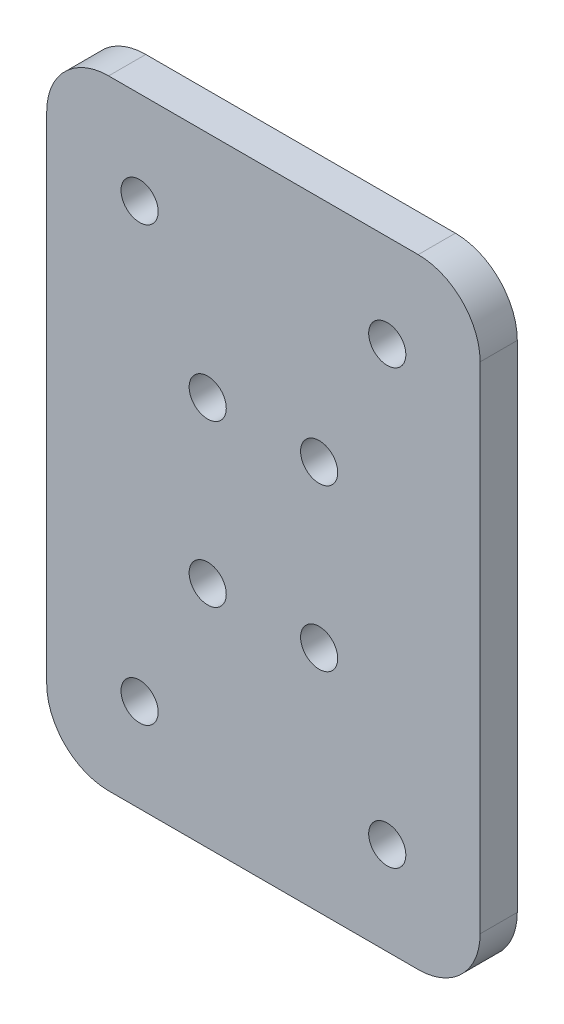
ISO-10303-21;
HEADER;
FILE_DESCRIPTION(('STEP AP214'),'2;1');
FILE_NAME('part.step','',(''),(''),'','','');
FILE_SCHEMA(('AUTOMOTIVE_DESIGN { 1 0 10303 214 1 1 1 1 }'));
ENDSEC;
DATA;
#1=APPLICATION_CONTEXT('core data for automotive mechanical design processes');
#2=APPLICATION_PROTOCOL_DEFINITION('international standard','automotive_design',2000,#1);
#3=PRODUCT_CONTEXT('',#1,'mechanical');
#4=PRODUCT('Part','Part','',(#3));
#5=PRODUCT_RELATED_PRODUCT_CATEGORY('part','',(#4));
#6=PRODUCT_DEFINITION_FORMATION('','',#4);
#7=PRODUCT_DEFINITION_CONTEXT('part definition',#1,'design');
#8=PRODUCT_DEFINITION('design','',#6,#7);
#9=PRODUCT_DEFINITION_SHAPE('','',#8);
#10=(LENGTH_UNIT() NAMED_UNIT(*) SI_UNIT(.MILLI.,.METRE.));
#11=(NAMED_UNIT(*) PLANE_ANGLE_UNIT() SI_UNIT($,.RADIAN.));
#12=(NAMED_UNIT(*) SI_UNIT($,.STERADIAN.) SOLID_ANGLE_UNIT());
#13=UNCERTAINTY_MEASURE_WITH_UNIT(LENGTH_MEASURE(1.E-05),#10,'distance_accuracy_value','');
#14=(GEOMETRIC_REPRESENTATION_CONTEXT(3) GLOBAL_UNCERTAINTY_ASSIGNED_CONTEXT((#13)) GLOBAL_UNIT_ASSIGNED_CONTEXT((#10,
#11,#12)) REPRESENTATION_CONTEXT('',''));
#15=CARTESIAN_POINT('',(0.,0.,0.));
#16=DIRECTION('',(0.,0.,1.));
#17=DIRECTION('',(1.,0.,0.));
#18=AXIS2_PLACEMENT_3D('',#15,#16,#17);
#19=CARTESIAN_POINT('',(0.,0.,3.));
#20=DIRECTION('',(0.,0.,1.));
#21=DIRECTION('',(1.,0.,0.));
#22=AXIS2_PLACEMENT_3D('',#19,#20,#21);
#23=PLANE('',#22);
#24=CARTESIAN_POINT('',(-4.5,-6.5,3.));
#25=DIRECTION('',(0.,0.,1.));
#26=DIRECTION('',(1.,0.,0.));
#27=AXIS2_PLACEMENT_3D('',#24,#25,#26);
#28=CIRCLE('',#27,1.5);
#29=CARTESIAN_POINT('',(-3.,-6.5,3.));
#30=VERTEX_POINT('',#29);
#31=EDGE_CURVE('E217',#30,#30,#28,.T.);
#32=ORIENTED_EDGE('',*,*,#31,.F.);
#33=EDGE_LOOP('',(#32));
#34=FACE_BOUND('',#33,.T.);
#35=CARTESIAN_POINT('',(4.5,6.5,3.));
#36=DIRECTION('',(0.,0.,1.));
#37=DIRECTION('',(1.,0.,0.));
#38=AXIS2_PLACEMENT_3D('',#35,#36,#37);
#39=CIRCLE('',#38,1.5);
#40=CARTESIAN_POINT('',(6.,6.5,3.));
#41=VERTEX_POINT('',#40);
#42=EDGE_CURVE('E205',#41,#41,#39,.T.);
#43=ORIENTED_EDGE('',*,*,#42,.F.);
#44=EDGE_LOOP('',(#43));
#45=FACE_BOUND('',#44,.T.);
#46=CARTESIAN_POINT('',(10.,17.5,3.));
#47=DIRECTION('',(0.,0.,1.));
#48=DIRECTION('',(1.,0.,0.));
#49=AXIS2_PLACEMENT_3D('',#46,#47,#48);
#50=CIRCLE('',#49,1.5);
#51=CARTESIAN_POINT('',(11.5,17.5,3.));
#52=VERTEX_POINT('',#51);
#53=EDGE_CURVE('E193',#52,#52,#50,.T.);
#54=ORIENTED_EDGE('',*,*,#53,.F.);
#55=EDGE_LOOP('',(#54));
#56=FACE_BOUND('',#55,.T.);
#57=CARTESIAN_POINT('',(-10.,-17.5,3.));
#58=DIRECTION('',(0.,0.,1.));
#59=DIRECTION('',(1.,0.,0.));
#60=AXIS2_PLACEMENT_3D('',#57,#58,#59);
#61=CIRCLE('',#60,1.5);
#62=CARTESIAN_POINT('',(-8.5,-17.5,3.));
#63=VERTEX_POINT('',#62);
#64=EDGE_CURVE('E131',#63,#63,#61,.T.);
#65=ORIENTED_EDGE('',*,*,#64,.F.);
#66=EDGE_LOOP('',(#65));
#67=FACE_BOUND('',#66,.T.);
#68=DIRECTION('',(1.,0.,0.));
#69=VECTOR('',#68,1.);
#70=CARTESIAN_POINT('',(-17.5,-25.,3.));
#71=LINE('',#70,#69);
#72=CARTESIAN_POINT('',(-12.5,-25.,3.));
#73=VERTEX_POINT('',#72);
#74=CARTESIAN_POINT('',(12.5,-25.,3.));
#75=VERTEX_POINT('',#74);
#76=EDGE_CURVE('E140',#73,#75,#71,.T.);
#77=ORIENTED_EDGE('',*,*,#76,.T.);
#78=CARTESIAN_POINT('',(12.5,-20.,3.));
#79=DIRECTION('',(0.,0.,1.));
#80=DIRECTION('',(1.,0.,0.));
#81=AXIS2_PLACEMENT_3D('',#78,#79,#80);
#82=CIRCLE('',#81,5.);
#83=CARTESIAN_POINT('',(17.5,-20.,3.));
#84=VERTEX_POINT('',#83);
#85=EDGE_CURVE('E158',#75,#84,#82,.T.);
#86=ORIENTED_EDGE('',*,*,#85,.T.);
#87=DIRECTION('',(0.,1.,0.));
#88=VECTOR('',#87,1.);
#89=CARTESIAN_POINT('',(17.5,25.,3.));
#90=LINE('',#89,#88);
#91=CARTESIAN_POINT('',(17.5,20.,3.));
#92=VERTEX_POINT('',#91);
#93=EDGE_CURVE('E122',#84,#92,#90,.T.);
#94=ORIENTED_EDGE('',*,*,#93,.T.);
#95=CARTESIAN_POINT('',(12.5,20.,3.));
#96=DIRECTION('',(0.,0.,1.));
#97=DIRECTION('',(1.,0.,0.));
#98=AXIS2_PLACEMENT_3D('',#95,#96,#97);
#99=CIRCLE('',#98,5.);
#100=CARTESIAN_POINT('',(12.5,25.,3.));
#101=VERTEX_POINT('',#100);
#102=EDGE_CURVE('E154',#92,#101,#99,.T.);
#103=ORIENTED_EDGE('',*,*,#102,.T.);
#104=DIRECTION('',(-1.,0.,0.));
#105=VECTOR('',#104,1.);
#106=CARTESIAN_POINT('',(-17.5,25.,3.));
#107=LINE('',#106,#105);
#108=CARTESIAN_POINT('',(-12.5,25.,3.));
#109=VERTEX_POINT('',#108);
#110=EDGE_CURVE('E167',#101,#109,#107,.T.);
#111=ORIENTED_EDGE('',*,*,#110,.T.);
#112=CARTESIAN_POINT('',(-12.5,20.,3.));
#113=DIRECTION('',(0.,0.,1.));
#114=DIRECTION('',(1.,0.,0.));
#115=AXIS2_PLACEMENT_3D('',#112,#113,#114);
#116=CIRCLE('',#115,5.);
#117=CARTESIAN_POINT('',(-17.5,20.,3.));
#118=VERTEX_POINT('',#117);
#119=EDGE_CURVE('E57',#109,#118,#116,.T.);
#120=ORIENTED_EDGE('',*,*,#119,.T.);
#121=DIRECTION('',(0.,-1.,0.));
#122=VECTOR('',#121,1.);
#123=CARTESIAN_POINT('',(-17.5,25.,3.));
#124=LINE('',#123,#122);
#125=CARTESIAN_POINT('',(-17.5,-20.,3.));
#126=VERTEX_POINT('',#125);
#127=EDGE_CURVE('E173',#118,#126,#124,.T.);
#128=ORIENTED_EDGE('',*,*,#127,.T.);
#129=CARTESIAN_POINT('',(-12.5,-20.,3.));
#130=DIRECTION('',(0.,0.,1.));
#131=DIRECTION('',(1.,0.,0.));
#132=AXIS2_PLACEMENT_3D('',#129,#130,#131);
#133=CIRCLE('',#132,5.);
#134=EDGE_CURVE('E156',#126,#73,#133,.T.);
#135=ORIENTED_EDGE('',*,*,#134,.T.);
#136=EDGE_LOOP('',(#77,#86,#94,#103,#111,#120,#128,#135));
#137=FACE_BOUND('',#136,.T.);
#138=CARTESIAN_POINT('',(10.,-17.5,3.));
#139=DIRECTION('',(0.,0.,1.));
#140=DIRECTION('',(1.,0.,0.));
#141=AXIS2_PLACEMENT_3D('',#138,#139,#140);
#142=CIRCLE('',#141,1.5);
#143=CARTESIAN_POINT('',(11.5,-17.5,3.));
#144=VERTEX_POINT('',#143);
#145=EDGE_CURVE('E188',#144,#144,#142,.T.);
#146=ORIENTED_EDGE('',*,*,#145,.F.);
#147=EDGE_LOOP('',(#146));
#148=FACE_BOUND('',#147,.T.);
#149=CARTESIAN_POINT('',(-10.,17.5,3.));
#150=DIRECTION('',(0.,0.,1.));
#151=DIRECTION('',(1.,0.,0.));
#152=AXIS2_PLACEMENT_3D('',#149,#150,#151);
#153=CIRCLE('',#152,1.5);
#154=CARTESIAN_POINT('',(-8.5,17.5,3.));
#155=VERTEX_POINT('',#154);
#156=EDGE_CURVE('E199',#155,#155,#153,.T.);
#157=ORIENTED_EDGE('',*,*,#156,.F.);
#158=EDGE_LOOP('',(#157));
#159=FACE_BOUND('',#158,.T.);
#160=CARTESIAN_POINT('',(-4.5,6.5,3.));
#161=DIRECTION('',(0.,0.,1.));
#162=DIRECTION('',(1.,0.,0.));
#163=AXIS2_PLACEMENT_3D('',#160,#161,#162);
#164=CIRCLE('',#163,1.5);
#165=CARTESIAN_POINT('',(-3.,6.5,3.));
#166=VERTEX_POINT('',#165);
#167=EDGE_CURVE('E211',#166,#166,#164,.T.);
#168=ORIENTED_EDGE('',*,*,#167,.F.);
#169=EDGE_LOOP('',(#168));
#170=FACE_BOUND('',#169,.T.);
#171=CARTESIAN_POINT('',(4.5,-6.5,3.));
#172=DIRECTION('',(0.,0.,1.));
#173=DIRECTION('',(1.,0.,0.));
#174=AXIS2_PLACEMENT_3D('',#171,#172,#173);
#175=CIRCLE('',#174,1.5);
#176=CARTESIAN_POINT('',(6.,-6.5,3.));
#177=VERTEX_POINT('',#176);
#178=EDGE_CURVE('E223',#177,#177,#175,.T.);
#179=ORIENTED_EDGE('',*,*,#178,.F.);
#180=EDGE_LOOP('',(#179));
#181=FACE_BOUND('',#180,.T.);
#182=ADVANCED_FACE('F35',(#34,#45,#56,#67,#137,#148,#159,#170,#181),#23,.T.);
#183=CARTESIAN_POINT('',(0.,0.,0.));
#184=DIRECTION('',(0.,0.,1.));
#185=DIRECTION('',(1.,0.,0.));
#186=AXIS2_PLACEMENT_3D('',#183,#184,#185);
#187=PLANE('',#186);
#188=DIRECTION('',(0.,1.,0.));
#189=VECTOR('',#188,1.);
#190=CARTESIAN_POINT('',(17.5,25.,0.));
#191=LINE('',#190,#189);
#192=CARTESIAN_POINT('',(17.5,-20.,0.));
#193=VERTEX_POINT('',#192);
#194=CARTESIAN_POINT('',(17.5,20.,0.));
#195=VERTEX_POINT('',#194);
#196=EDGE_CURVE('E119',#193,#195,#191,.T.);
#197=ORIENTED_EDGE('',*,*,#196,.F.);
#198=CARTESIAN_POINT('',(12.5,-20.,0.));
#199=DIRECTION('',(0.,0.,1.));
#200=DIRECTION('',(1.,0.,0.));
#201=AXIS2_PLACEMENT_3D('',#198,#199,#200);
#202=CIRCLE('',#201,5.);
#203=CARTESIAN_POINT('',(12.5,-25.,0.));
#204=VERTEX_POINT('',#203);
#205=EDGE_CURVE('E102',#193,#204,#202,.F.);
#206=ORIENTED_EDGE('',*,*,#205,.T.);
#207=DIRECTION('',(1.,0.,0.));
#208=VECTOR('',#207,1.);
#209=CARTESIAN_POINT('',(-17.5,-25.,0.));
#210=LINE('',#209,#208);
#211=CARTESIAN_POINT('',(-12.5,-25.,0.));
#212=VERTEX_POINT('',#211);
#213=EDGE_CURVE('E144',#212,#204,#210,.T.);
#214=ORIENTED_EDGE('',*,*,#213,.F.);
#215=CARTESIAN_POINT('',(-12.5,-20.,0.));
#216=DIRECTION('',(0.,0.,1.));
#217=DIRECTION('',(1.,0.,0.));
#218=AXIS2_PLACEMENT_3D('',#215,#216,#217);
#219=CIRCLE('',#218,5.);
#220=CARTESIAN_POINT('',(-17.5,-20.,0.));
#221=VERTEX_POINT('',#220);
#222=EDGE_CURVE('E113',#212,#221,#219,.F.);
#223=ORIENTED_EDGE('',*,*,#222,.T.);
#224=DIRECTION('',(0.,-1.,0.));
#225=VECTOR('',#224,1.);
#226=CARTESIAN_POINT('',(-17.5,25.,0.));
#227=LINE('',#226,#225);
#228=CARTESIAN_POINT('',(-17.5,20.,0.));
#229=VERTEX_POINT('',#228);
#230=EDGE_CURVE('E134',#229,#221,#227,.T.);
#231=ORIENTED_EDGE('',*,*,#230,.F.);
#232=CARTESIAN_POINT('',(-12.5,20.,0.));
#233=DIRECTION('',(0.,0.,1.));
#234=DIRECTION('',(1.,0.,0.));
#235=AXIS2_PLACEMENT_3D('',#232,#233,#234);
#236=CIRCLE('',#235,5.);
#237=CARTESIAN_POINT('',(-12.5,25.,0.));
#238=VERTEX_POINT('',#237);
#239=EDGE_CURVE('E123',#229,#238,#236,.F.);
#240=ORIENTED_EDGE('',*,*,#239,.T.);
#241=DIRECTION('',(-1.,0.,0.));
#242=VECTOR('',#241,1.);
#243=CARTESIAN_POINT('',(-17.5,25.,0.));
#244=LINE('',#243,#242);
#245=CARTESIAN_POINT('',(12.5,25.,0.));
#246=VERTEX_POINT('',#245);
#247=EDGE_CURVE('E130',#246,#238,#244,.T.);
#248=ORIENTED_EDGE('',*,*,#247,.F.);
#249=CARTESIAN_POINT('',(12.5,20.,0.));
#250=DIRECTION('',(0.,0.,1.));
#251=DIRECTION('',(1.,0.,0.));
#252=AXIS2_PLACEMENT_3D('',#249,#250,#251);
#253=CIRCLE('',#252,5.);
#254=EDGE_CURVE('E129',#246,#195,#253,.F.);
#255=ORIENTED_EDGE('',*,*,#254,.T.);
#256=EDGE_LOOP('',(#197,#206,#214,#223,#231,#240,#248,#255));
#257=FACE_BOUND('',#256,.T.);
#258=CARTESIAN_POINT('',(-10.,-17.5,0.));
#259=DIRECTION('',(0.,0.,1.));
#260=DIRECTION('',(1.,0.,0.));
#261=AXIS2_PLACEMENT_3D('',#258,#259,#260);
#262=CIRCLE('',#261,1.5);
#263=CARTESIAN_POINT('',(-8.5,-17.5,0.));
#264=VERTEX_POINT('',#263);
#265=EDGE_CURVE('E137',#264,#264,#262,.T.);
#266=ORIENTED_EDGE('',*,*,#265,.T.);
#267=EDGE_LOOP('',(#266));
#268=FACE_BOUND('',#267,.T.);
#269=CARTESIAN_POINT('',(10.,-17.5,0.));
#270=DIRECTION('',(0.,0.,1.));
#271=DIRECTION('',(1.,0.,0.));
#272=AXIS2_PLACEMENT_3D('',#269,#270,#271);
#273=CIRCLE('',#272,1.5);
#274=CARTESIAN_POINT('',(11.5,-17.5,0.));
#275=VERTEX_POINT('',#274);
#276=EDGE_CURVE('E190',#275,#275,#273,.T.);
#277=ORIENTED_EDGE('',*,*,#276,.T.);
#278=EDGE_LOOP('',(#277));
#279=FACE_BOUND('',#278,.T.);
#280=CARTESIAN_POINT('',(10.,17.5,0.));
#281=DIRECTION('',(0.,0.,1.));
#282=DIRECTION('',(1.,0.,0.));
#283=AXIS2_PLACEMENT_3D('',#280,#281,#282);
#284=CIRCLE('',#283,1.5);
#285=CARTESIAN_POINT('',(11.5,17.5,0.));
#286=VERTEX_POINT('',#285);
#287=EDGE_CURVE('E196',#286,#286,#284,.T.);
#288=ORIENTED_EDGE('',*,*,#287,.T.);
#289=EDGE_LOOP('',(#288));
#290=FACE_BOUND('',#289,.T.);
#291=CARTESIAN_POINT('',(-10.,17.5,0.));
#292=DIRECTION('',(0.,0.,1.));
#293=DIRECTION('',(1.,0.,0.));
#294=AXIS2_PLACEMENT_3D('',#291,#292,#293);
#295=CIRCLE('',#294,1.5);
#296=CARTESIAN_POINT('',(-8.5,17.5,0.));
#297=VERTEX_POINT('',#296);
#298=EDGE_CURVE('E202',#297,#297,#295,.T.);
#299=ORIENTED_EDGE('',*,*,#298,.T.);
#300=EDGE_LOOP('',(#299));
#301=FACE_BOUND('',#300,.T.);
#302=CARTESIAN_POINT('',(4.5,6.5,0.));
#303=DIRECTION('',(0.,0.,1.));
#304=DIRECTION('',(1.,0.,0.));
#305=AXIS2_PLACEMENT_3D('',#302,#303,#304);
#306=CIRCLE('',#305,1.5);
#307=CARTESIAN_POINT('',(6.,6.5,0.));
#308=VERTEX_POINT('',#307);
#309=EDGE_CURVE('E208',#308,#308,#306,.T.);
#310=ORIENTED_EDGE('',*,*,#309,.T.);
#311=EDGE_LOOP('',(#310));
#312=FACE_BOUND('',#311,.T.);
#313=CARTESIAN_POINT('',(-4.5,6.5,0.));
#314=DIRECTION('',(0.,0.,1.));
#315=DIRECTION('',(1.,0.,0.));
#316=AXIS2_PLACEMENT_3D('',#313,#314,#315);
#317=CIRCLE('',#316,1.5);
#318=CARTESIAN_POINT('',(-3.,6.5,0.));
#319=VERTEX_POINT('',#318);
#320=EDGE_CURVE('E214',#319,#319,#317,.T.);
#321=ORIENTED_EDGE('',*,*,#320,.T.);
#322=EDGE_LOOP('',(#321));
#323=FACE_BOUND('',#322,.T.);
#324=CARTESIAN_POINT('',(-4.5,-6.5,0.));
#325=DIRECTION('',(0.,0.,1.));
#326=DIRECTION('',(1.,0.,0.));
#327=AXIS2_PLACEMENT_3D('',#324,#325,#326);
#328=CIRCLE('',#327,1.5);
#329=CARTESIAN_POINT('',(-3.,-6.5,0.));
#330=VERTEX_POINT('',#329);
#331=EDGE_CURVE('E220',#330,#330,#328,.T.);
#332=ORIENTED_EDGE('',*,*,#331,.T.);
#333=EDGE_LOOP('',(#332));
#334=FACE_BOUND('',#333,.T.);
#335=CARTESIAN_POINT('',(4.5,-6.5,0.));
#336=DIRECTION('',(0.,0.,1.));
#337=DIRECTION('',(1.,0.,0.));
#338=AXIS2_PLACEMENT_3D('',#335,#336,#337);
#339=CIRCLE('',#338,1.5);
#340=CARTESIAN_POINT('',(6.,-6.5,0.));
#341=VERTEX_POINT('',#340);
#342=EDGE_CURVE('E226',#341,#341,#339,.T.);
#343=ORIENTED_EDGE('',*,*,#342,.T.);
#344=EDGE_LOOP('',(#343));
#345=FACE_BOUND('',#344,.T.);
#346=ADVANCED_FACE('F126',(#257,#268,#279,#290,#301,#312,#323,#334,#345),#187,.F.);
#347=CARTESIAN_POINT('',(17.5,25.,3.));
#348=DIRECTION('',(-1.,0.,0.));
#349=DIRECTION('',(0.,-1.,0.));
#350=AXIS2_PLACEMENT_3D('',#347,#348,#349);
#351=PLANE('',#350);
#352=ORIENTED_EDGE('',*,*,#93,.F.);
#353=DIRECTION('',(0.,0.,-1.));
#354=VECTOR('',#353,1.);
#355=CARTESIAN_POINT('',(17.5,-20.,3.));
#356=LINE('',#355,#354);
#357=EDGE_CURVE('E106',#84,#193,#356,.T.);
#358=ORIENTED_EDGE('',*,*,#357,.T.);
#359=ORIENTED_EDGE('',*,*,#196,.T.);
#360=DIRECTION('',(0.,0.,-1.));
#361=VECTOR('',#360,1.);
#362=CARTESIAN_POINT('',(17.5,20.,3.));
#363=LINE('',#362,#361);
#364=EDGE_CURVE('E124',#195,#92,#363,.F.);
#365=ORIENTED_EDGE('',*,*,#364,.T.);
#366=EDGE_LOOP('',(#352,#358,#359,#365));
#367=FACE_BOUND('',#366,.T.);
#368=ADVANCED_FACE('F118',(#367),#351,.F.);
#369=CARTESIAN_POINT('',(-17.5,25.,3.));
#370=DIRECTION('',(0.,-1.,0.));
#371=DIRECTION('',(1.,0.,0.));
#372=AXIS2_PLACEMENT_3D('',#369,#370,#371);
#373=PLANE('',#372);
#374=ORIENTED_EDGE('',*,*,#110,.F.);
#375=DIRECTION('',(0.,0.,-1.));
#376=VECTOR('',#375,1.);
#377=CARTESIAN_POINT('',(12.5,25.,3.));
#378=LINE('',#377,#376);
#379=EDGE_CURVE('E11',#101,#246,#378,.T.);
#380=ORIENTED_EDGE('',*,*,#379,.T.);
#381=ORIENTED_EDGE('',*,*,#247,.T.);
#382=DIRECTION('',(0.,0.,-1.));
#383=VECTOR('',#382,1.);
#384=CARTESIAN_POINT('',(-12.5,25.,3.));
#385=LINE('',#384,#383);
#386=EDGE_CURVE('E43',#238,#109,#385,.F.);
#387=ORIENTED_EDGE('',*,*,#386,.T.);
#388=EDGE_LOOP('',(#374,#380,#381,#387));
#389=FACE_BOUND('',#388,.T.);
#390=ADVANCED_FACE('F166',(#389),#373,.F.);
#391=CARTESIAN_POINT('',(-17.5,25.,3.));
#392=DIRECTION('',(1.,0.,0.));
#393=DIRECTION('',(0.,1.,0.));
#394=AXIS2_PLACEMENT_3D('',#391,#392,#393);
#395=PLANE('',#394);
#396=ORIENTED_EDGE('',*,*,#230,.T.);
#397=DIRECTION('',(0.,0.,-1.));
#398=VECTOR('',#397,1.);
#399=CARTESIAN_POINT('',(-17.5,-20.,3.));
#400=LINE('',#399,#398);
#401=EDGE_CURVE('E50',#221,#126,#400,.F.);
#402=ORIENTED_EDGE('',*,*,#401,.T.);
#403=ORIENTED_EDGE('',*,*,#127,.F.);
#404=DIRECTION('',(0.,0.,-1.));
#405=VECTOR('',#404,1.);
#406=CARTESIAN_POINT('',(-17.5,20.,3.));
#407=LINE('',#406,#405);
#408=EDGE_CURVE('E160',#118,#229,#407,.T.);
#409=ORIENTED_EDGE('',*,*,#408,.T.);
#410=EDGE_LOOP('',(#396,#402,#403,#409));
#411=FACE_BOUND('',#410,.T.);
#412=ADVANCED_FACE('F177',(#411),#395,.F.);
#413=CARTESIAN_POINT('',(-17.5,-25.,3.));
#414=DIRECTION('',(0.,1.,0.));
#415=DIRECTION('',(0.,0.,1.));
#416=AXIS2_PLACEMENT_3D('',#413,#414,#415);
#417=PLANE('',#416);
#418=ORIENTED_EDGE('',*,*,#213,.T.);
#419=DIRECTION('',(0.,0.,-1.));
#420=VECTOR('',#419,1.);
#421=CARTESIAN_POINT('',(12.5,-25.,3.));
#422=LINE('',#421,#420);
#423=EDGE_CURVE('E107',#204,#75,#422,.F.);
#424=ORIENTED_EDGE('',*,*,#423,.T.);
#425=ORIENTED_EDGE('',*,*,#76,.F.);
#426=DIRECTION('',(0.,0.,-1.));
#427=VECTOR('',#426,1.);
#428=CARTESIAN_POINT('',(-12.5,-25.,3.));
#429=LINE('',#428,#427);
#430=EDGE_CURVE('E112',#73,#212,#429,.T.);
#431=ORIENTED_EDGE('',*,*,#430,.T.);
#432=EDGE_LOOP('',(#418,#424,#425,#431));
#433=FACE_BOUND('',#432,.T.);
#434=ADVANCED_FACE('F184',(#433),#417,.F.);
#435=CARTESIAN_POINT('',(-10.,-17.5,3.));
#436=DIRECTION('',(0.,0.,-1.));
#437=DIRECTION('',(-1.,0.,0.));
#438=AXIS2_PLACEMENT_3D('',#435,#436,#437);
#439=CYLINDRICAL_SURFACE('',#438,1.5);
#440=ORIENTED_EDGE('',*,*,#64,.T.);
#441=EDGE_LOOP('',(#440));
#442=FACE_BOUND('',#441,.T.);
#443=ORIENTED_EDGE('',*,*,#265,.F.);
#444=EDGE_LOOP('',(#443));
#445=FACE_BOUND('',#444,.T.);
#446=ADVANCED_FACE('F245',(#442,#445),#439,.F.);
#447=CARTESIAN_POINT('',(10.,-17.5,3.));
#448=DIRECTION('',(0.,0.,-1.));
#449=DIRECTION('',(-1.,0.,0.));
#450=AXIS2_PLACEMENT_3D('',#447,#448,#449);
#451=CYLINDRICAL_SURFACE('',#450,1.5);
#452=ORIENTED_EDGE('',*,*,#145,.T.);
#453=EDGE_LOOP('',(#452));
#454=FACE_BOUND('',#453,.T.);
#455=ORIENTED_EDGE('',*,*,#276,.F.);
#456=EDGE_LOOP('',(#455));
#457=FACE_BOUND('',#456,.T.);
#458=ADVANCED_FACE('F377',(#454,#457),#451,.F.);
#459=CARTESIAN_POINT('',(10.,17.5,3.));
#460=DIRECTION('',(0.,0.,-1.));
#461=DIRECTION('',(-1.,0.,0.));
#462=AXIS2_PLACEMENT_3D('',#459,#460,#461);
#463=CYLINDRICAL_SURFACE('',#462,1.5);
#464=ORIENTED_EDGE('',*,*,#53,.T.);
#465=EDGE_LOOP('',(#464));
#466=FACE_BOUND('',#465,.T.);
#467=ORIENTED_EDGE('',*,*,#287,.F.);
#468=EDGE_LOOP('',(#467));
#469=FACE_BOUND('',#468,.T.);
#470=ADVANCED_FACE('F367',(#466,#469),#463,.F.);
#471=CARTESIAN_POINT('',(-10.,17.5,3.));
#472=DIRECTION('',(0.,0.,-1.));
#473=DIRECTION('',(-1.,0.,0.));
#474=AXIS2_PLACEMENT_3D('',#471,#472,#473);
#475=CYLINDRICAL_SURFACE('',#474,1.5);
#476=ORIENTED_EDGE('',*,*,#156,.T.);
#477=EDGE_LOOP('',(#476));
#478=FACE_BOUND('',#477,.T.);
#479=ORIENTED_EDGE('',*,*,#298,.F.);
#480=EDGE_LOOP('',(#479));
#481=FACE_BOUND('',#480,.T.);
#482=ADVANCED_FACE('F357',(#478,#481),#475,.F.);
#483=CARTESIAN_POINT('',(4.5,6.5,3.));
#484=DIRECTION('',(0.,0.,-1.));
#485=DIRECTION('',(-1.,0.,0.));
#486=AXIS2_PLACEMENT_3D('',#483,#484,#485);
#487=CYLINDRICAL_SURFACE('',#486,1.5);
#488=ORIENTED_EDGE('',*,*,#42,.T.);
#489=EDGE_LOOP('',(#488));
#490=FACE_BOUND('',#489,.T.);
#491=ORIENTED_EDGE('',*,*,#309,.F.);
#492=EDGE_LOOP('',(#491));
#493=FACE_BOUND('',#492,.T.);
#494=ADVANCED_FACE('F347',(#490,#493),#487,.F.);
#495=CARTESIAN_POINT('',(-4.5,6.5,3.));
#496=DIRECTION('',(0.,0.,-1.));
#497=DIRECTION('',(-1.,0.,0.));
#498=AXIS2_PLACEMENT_3D('',#495,#496,#497);
#499=CYLINDRICAL_SURFACE('',#498,1.5);
#500=ORIENTED_EDGE('',*,*,#167,.T.);
#501=EDGE_LOOP('',(#500));
#502=FACE_BOUND('',#501,.T.);
#503=ORIENTED_EDGE('',*,*,#320,.F.);
#504=EDGE_LOOP('',(#503));
#505=FACE_BOUND('',#504,.T.);
#506=ADVANCED_FACE('F337',(#502,#505),#499,.F.);
#507=CARTESIAN_POINT('',(-4.5,-6.5,3.));
#508=DIRECTION('',(0.,0.,-1.));
#509=DIRECTION('',(-1.,0.,0.));
#510=AXIS2_PLACEMENT_3D('',#507,#508,#509);
#511=CYLINDRICAL_SURFACE('',#510,1.5);
#512=ORIENTED_EDGE('',*,*,#31,.T.);
#513=EDGE_LOOP('',(#512));
#514=FACE_BOUND('',#513,.T.);
#515=ORIENTED_EDGE('',*,*,#331,.F.);
#516=EDGE_LOOP('',(#515));
#517=FACE_BOUND('',#516,.T.);
#518=ADVANCED_FACE('F328',(#514,#517),#511,.F.);
#519=CARTESIAN_POINT('',(4.5,-6.5,3.));
#520=DIRECTION('',(0.,0.,-1.));
#521=DIRECTION('',(-1.,0.,0.));
#522=AXIS2_PLACEMENT_3D('',#519,#520,#521);
#523=CYLINDRICAL_SURFACE('',#522,1.5);
#524=ORIENTED_EDGE('',*,*,#178,.T.);
#525=EDGE_LOOP('',(#524));
#526=FACE_BOUND('',#525,.T.);
#527=ORIENTED_EDGE('',*,*,#342,.F.);
#528=EDGE_LOOP('',(#527));
#529=FACE_BOUND('',#528,.T.);
#530=ADVANCED_FACE('F232',(#526,#529),#523,.F.);
#531=CARTESIAN_POINT('',(12.5,-20.,3.));
#532=DIRECTION('',(0.,0.,-1.));
#533=DIRECTION('',(-1.,0.,0.));
#534=AXIS2_PLACEMENT_3D('',#531,#532,#533);
#535=CYLINDRICAL_SURFACE('',#534,5.);
#536=ORIENTED_EDGE('',*,*,#85,.F.);
#537=ORIENTED_EDGE('',*,*,#423,.F.);
#538=ORIENTED_EDGE('',*,*,#205,.F.);
#539=ORIENTED_EDGE('',*,*,#357,.F.);
#540=EDGE_LOOP('',(#536,#537,#538,#539));
#541=FACE_BOUND('',#540,.T.);
#542=ADVANCED_FACE('F105',(#541),#535,.T.);
#543=CARTESIAN_POINT('',(-12.5,-20.,3.));
#544=DIRECTION('',(0.,0.,-1.));
#545=DIRECTION('',(-1.,0.,0.));
#546=AXIS2_PLACEMENT_3D('',#543,#544,#545);
#547=CYLINDRICAL_SURFACE('',#546,5.);
#548=ORIENTED_EDGE('',*,*,#134,.F.);
#549=ORIENTED_EDGE('',*,*,#401,.F.);
#550=ORIENTED_EDGE('',*,*,#222,.F.);
#551=ORIENTED_EDGE('',*,*,#430,.F.);
#552=EDGE_LOOP('',(#548,#549,#550,#551));
#553=FACE_BOUND('',#552,.T.);
#554=ADVANCED_FACE('F181',(#553),#547,.T.);
#555=CARTESIAN_POINT('',(12.5,20.,3.));
#556=DIRECTION('',(0.,0.,-1.));
#557=DIRECTION('',(-1.,0.,0.));
#558=AXIS2_PLACEMENT_3D('',#555,#556,#557);
#559=CYLINDRICAL_SURFACE('',#558,5.);
#560=ORIENTED_EDGE('',*,*,#102,.F.);
#561=ORIENTED_EDGE('',*,*,#364,.F.);
#562=ORIENTED_EDGE('',*,*,#254,.F.);
#563=ORIENTED_EDGE('',*,*,#379,.F.);
#564=EDGE_LOOP('',(#560,#561,#562,#563));
#565=FACE_BOUND('',#564,.T.);
#566=ADVANCED_FACE('F259',(#565),#559,.T.);
#567=CARTESIAN_POINT('',(-12.5,20.,3.));
#568=DIRECTION('',(0.,0.,-1.));
#569=DIRECTION('',(-1.,0.,0.));
#570=AXIS2_PLACEMENT_3D('',#567,#568,#569);
#571=CYLINDRICAL_SURFACE('',#570,5.);
#572=ORIENTED_EDGE('',*,*,#119,.F.);
#573=ORIENTED_EDGE('',*,*,#386,.F.);
#574=ORIENTED_EDGE('',*,*,#239,.F.);
#575=ORIENTED_EDGE('',*,*,#408,.F.);
#576=EDGE_LOOP('',(#572,#573,#574,#575));
#577=FACE_BOUND('',#576,.T.);
#578=ADVANCED_FACE('F37',(#577),#571,.T.);
#579=CLOSED_SHELL('',(#182,#346,#368,#390,#412,#434,#446,#458,#470,#482,#494,#506,#518,#530,
#542,#554,#566,#578));
#580=MANIFOLD_SOLID_BREP('B2',#579);
#581=ADVANCED_BREP_SHAPE_REPRESENTATION('',(#18,#580),#14);
#582=SHAPE_DEFINITION_REPRESENTATION(#9,#581);
ENDSEC;
END-ISO-10303-21;
